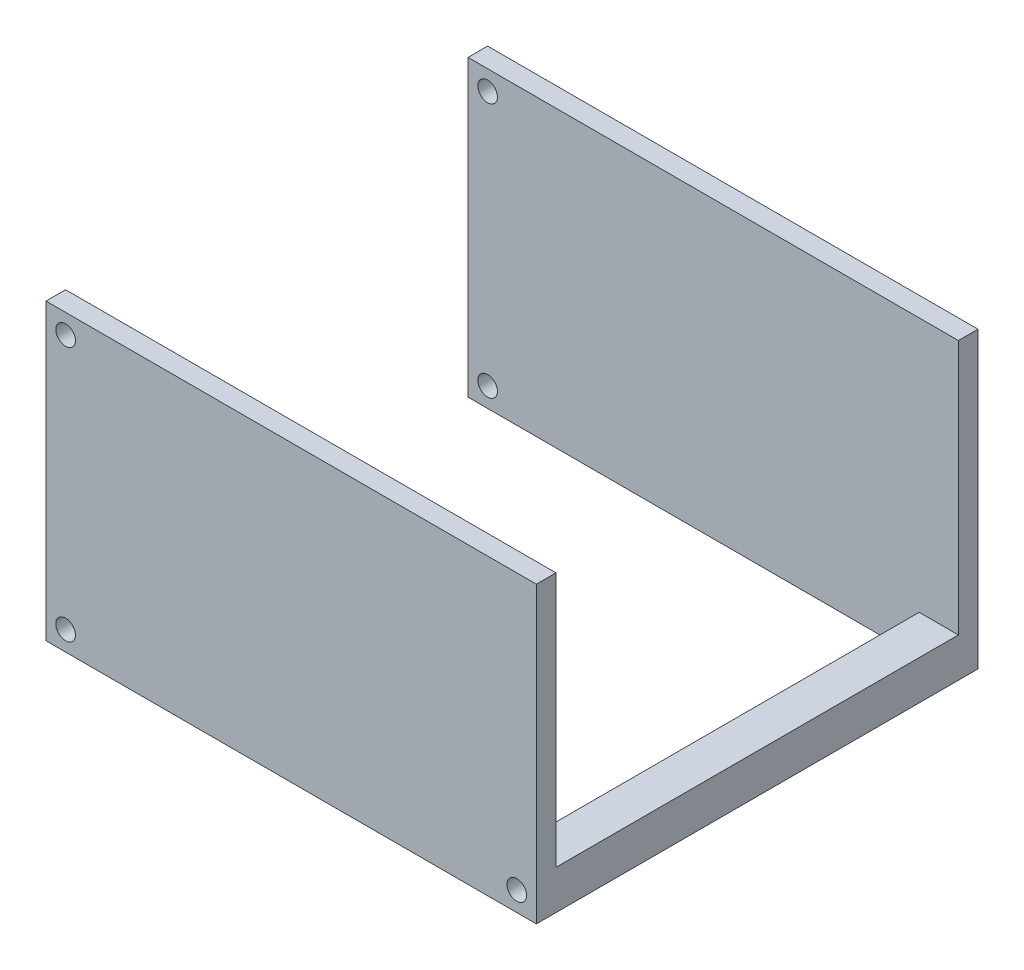
ISO-10303-21;
HEADER;
FILE_DESCRIPTION(('STEP AP214'),'2;1');
FILE_NAME('part.step','',(''),(''),'','','');
FILE_SCHEMA(('AUTOMOTIVE_DESIGN { 1 0 10303 214 1 1 1 1 }'));
ENDSEC;
DATA;
#1=APPLICATION_CONTEXT('core data for automotive mechanical design processes');
#2=APPLICATION_PROTOCOL_DEFINITION('international standard','automotive_design',2000,#1);
#3=PRODUCT_CONTEXT('',#1,'mechanical');
#4=PRODUCT('Part','Part','',(#3));
#5=PRODUCT_RELATED_PRODUCT_CATEGORY('part','',(#4));
#6=PRODUCT_DEFINITION_FORMATION('','',#4);
#7=PRODUCT_DEFINITION_CONTEXT('part definition',#1,'design');
#8=PRODUCT_DEFINITION('design','',#6,#7);
#9=PRODUCT_DEFINITION_SHAPE('','',#8);
#10=(LENGTH_UNIT() NAMED_UNIT(*) SI_UNIT(.MILLI.,.METRE.));
#11=(NAMED_UNIT(*) PLANE_ANGLE_UNIT() SI_UNIT($,.RADIAN.));
#12=(NAMED_UNIT(*) SI_UNIT($,.STERADIAN.) SOLID_ANGLE_UNIT());
#13=UNCERTAINTY_MEASURE_WITH_UNIT(LENGTH_MEASURE(1.E-05),#10,'distance_accuracy_value','');
#14=(GEOMETRIC_REPRESENTATION_CONTEXT(3) GLOBAL_UNCERTAINTY_ASSIGNED_CONTEXT((#13)) GLOBAL_UNIT_ASSIGNED_CONTEXT((#10,
#11,#12)) REPRESENTATION_CONTEXT('',''));
#15=CARTESIAN_POINT('',(0.,0.,0.));
#16=DIRECTION('',(0.,0.,1.));
#17=DIRECTION('',(1.,0.,0.));
#18=AXIS2_PLACEMENT_3D('',#15,#16,#17);
#19=CARTESIAN_POINT('',(-25.,15.,45.03));
#20=DIRECTION('',(0.,-1.,0.));
#21=DIRECTION('',(0.,0.,-1.));
#22=AXIS2_PLACEMENT_3D('',#19,#20,#21);
#23=PLANE('',#22);
#24=DIRECTION('',(-1.,0.,0.));
#25=VECTOR('',#24,1.);
#26=CARTESIAN_POINT('',(-25.,15.,2.));
#27=LINE('',#26,#25);
#28=CARTESIAN_POINT('',(25.,15.,2.));
#29=VERTEX_POINT('',#28);
#30=CARTESIAN_POINT('',(-25.,15.,2.));
#31=VERTEX_POINT('',#30);
#32=EDGE_CURVE('E147',#29,#31,#27,.T.);
#33=ORIENTED_EDGE('',*,*,#32,.F.);
#34=DIRECTION('',(0.,0.,-1.));
#35=VECTOR('',#34,1.);
#36=CARTESIAN_POINT('',(25.,15.,45.03));
#37=LINE('',#36,#35);
#38=CARTESIAN_POINT('',(25.,15.,0.));
#39=VERTEX_POINT('',#38);
#40=EDGE_CURVE('E210',#29,#39,#37,.T.);
#41=ORIENTED_EDGE('',*,*,#40,.T.);
#42=DIRECTION('',(-1.,0.,0.));
#43=VECTOR('',#42,1.);
#44=CARTESIAN_POINT('',(-25.,15.,0.));
#45=LINE('',#44,#43);
#46=CARTESIAN_POINT('',(-25.,15.,0.));
#47=VERTEX_POINT('',#46);
#48=EDGE_CURVE('E191',#39,#47,#45,.T.);
#49=ORIENTED_EDGE('',*,*,#48,.T.);
#50=DIRECTION('',(0.,0.,-1.));
#51=VECTOR('',#50,1.);
#52=CARTESIAN_POINT('',(-25.,15.,45.03));
#53=LINE('',#52,#51);
#54=EDGE_CURVE('E197',#31,#47,#53,.T.);
#55=ORIENTED_EDGE('',*,*,#54,.F.);
#56=EDGE_LOOP('',(#33,#41,#49,#55));
#57=FACE_BOUND('',#56,.T.);
#58=ADVANCED_FACE('F36',(#57),#23,.F.);
#59=CARTESIAN_POINT('',(21.,-30.03,2.));
#60=DIRECTION('',(1.,0.,0.));
#61=DIRECTION('',(0.,0.,-1.));
#62=AXIS2_PLACEMENT_3D('',#59,#60,#61);
#63=PLANE('',#62);
#64=DIRECTION('',(0.,0.,1.));
#65=VECTOR('',#64,1.);
#66=CARTESIAN_POINT('',(21.,-11.,2.));
#67=LINE('',#66,#65);
#68=CARTESIAN_POINT('',(21.,-11.,2.));
#69=VERTEX_POINT('',#68);
#70=CARTESIAN_POINT('',(21.,-11.,43.03));
#71=VERTEX_POINT('',#70);
#72=EDGE_CURVE('E53',#69,#71,#67,.T.);
#73=ORIENTED_EDGE('',*,*,#72,.F.);
#74=DIRECTION('',(0.,1.,0.));
#75=VECTOR('',#74,1.);
#76=CARTESIAN_POINT('',(21.,-30.03,2.));
#77=LINE('',#76,#75);
#78=CARTESIAN_POINT('',(21.,-15.,2.));
#79=VERTEX_POINT('',#78);
#80=EDGE_CURVE('E153',#79,#69,#77,.T.);
#81=ORIENTED_EDGE('',*,*,#80,.F.);
#82=DIRECTION('',(0.,0.,-1.));
#83=VECTOR('',#82,1.);
#84=CARTESIAN_POINT('',(21.,-15.,45.03));
#85=LINE('',#84,#83);
#86=CARTESIAN_POINT('',(21.,-15.,43.03));
#87=VERTEX_POINT('',#86);
#88=EDGE_CURVE('E171',#87,#79,#85,.T.);
#89=ORIENTED_EDGE('',*,*,#88,.F.);
#90=DIRECTION('',(0.,1.,0.));
#91=VECTOR('',#90,1.);
#92=CARTESIAN_POINT('',(21.,-30.03,43.03));
#93=LINE('',#92,#91);
#94=EDGE_CURVE('E156',#87,#71,#93,.T.);
#95=ORIENTED_EDGE('',*,*,#94,.T.);
#96=EDGE_LOOP('',(#73,#81,#89,#95));
#97=FACE_BOUND('',#96,.T.);
#98=ADVANCED_FACE('F245',(#97),#63,.F.);
#99=CARTESIAN_POINT('',(-25.,15.,45.03));
#100=DIRECTION('',(1.,0.,0.));
#101=DIRECTION('',(0.,1.,0.));
#102=AXIS2_PLACEMENT_3D('',#99,#100,#101);
#103=PLANE('',#102);
#104=DIRECTION('',(0.,0.,-1.));
#105=VECTOR('',#104,1.);
#106=CARTESIAN_POINT('',(-25.,-15.,45.03));
#107=LINE('',#106,#105);
#108=CARTESIAN_POINT('',(-25.,-15.,2.));
#109=VERTEX_POINT('',#108);
#110=CARTESIAN_POINT('',(-25.,-15.,0.));
#111=VERTEX_POINT('',#110);
#112=EDGE_CURVE('E45',#109,#111,#107,.T.);
#113=ORIENTED_EDGE('',*,*,#112,.F.);
#114=DIRECTION('',(0.,1.,0.));
#115=VECTOR('',#114,1.);
#116=CARTESIAN_POINT('',(-25.,-30.03,2.));
#117=LINE('',#116,#115);
#118=EDGE_CURVE('E149',#109,#31,#117,.T.);
#119=ORIENTED_EDGE('',*,*,#118,.T.);
#120=ORIENTED_EDGE('',*,*,#54,.T.);
#121=DIRECTION('',(0.,-1.,0.));
#122=VECTOR('',#121,1.);
#123=CARTESIAN_POINT('',(-25.,15.,0.));
#124=LINE('',#123,#122);
#125=EDGE_CURVE('E184',#47,#111,#124,.T.);
#126=ORIENTED_EDGE('',*,*,#125,.T.);
#127=EDGE_LOOP('',(#113,#119,#120,#126));
#128=FACE_BOUND('',#127,.T.);
#129=ADVANCED_FACE('F252',(#128),#103,.F.);
#130=CARTESIAN_POINT('',(-23.,-13.,45.03));
#131=DIRECTION('',(0.,0.,-1.));
#132=DIRECTION('',(-1.,0.,0.));
#133=AXIS2_PLACEMENT_3D('',#130,#131,#132);
#134=CYLINDRICAL_SURFACE('',#133,1.);
#135=CARTESIAN_POINT('',(-23.,-13.,2.));
#136=DIRECTION('',(0.,0.,-1.));
#137=DIRECTION('',(-1.,0.,0.));
#138=AXIS2_PLACEMENT_3D('',#135,#136,#137);
#139=CIRCLE('',#138,1.);
#140=CARTESIAN_POINT('',(-24.,-13.,2.));
#141=VERTEX_POINT('',#140);
#142=EDGE_CURVE('E165',#141,#141,#139,.T.);
#143=ORIENTED_EDGE('',*,*,#142,.F.);
#144=EDGE_LOOP('',(#143));
#145=FACE_BOUND('',#144,.T.);
#146=CARTESIAN_POINT('',(-23.,-13.,0.));
#147=DIRECTION('',(0.,0.,1.));
#148=DIRECTION('',(1.,0.,0.));
#149=AXIS2_PLACEMENT_3D('',#146,#147,#148);
#150=CIRCLE('',#149,1.);
#151=CARTESIAN_POINT('',(-22.,-13.,0.));
#152=VERTEX_POINT('',#151);
#153=EDGE_CURVE('E178',#152,#152,#150,.T.);
#154=ORIENTED_EDGE('',*,*,#153,.F.);
#155=EDGE_LOOP('',(#154));
#156=FACE_BOUND('',#155,.T.);
#157=ADVANCED_FACE('F239',(#145,#156),#134,.F.);
#158=CARTESIAN_POINT('',(-23.,13.,45.03));
#159=DIRECTION('',(0.,0.,-1.));
#160=DIRECTION('',(-1.,0.,0.));
#161=AXIS2_PLACEMENT_3D('',#158,#159,#160);
#162=CYLINDRICAL_SURFACE('',#161,1.);
#163=CARTESIAN_POINT('',(-23.,13.,2.));
#164=DIRECTION('',(0.,0.,-1.));
#165=DIRECTION('',(-1.,0.,0.));
#166=AXIS2_PLACEMENT_3D('',#163,#164,#165);
#167=CIRCLE('',#166,1.);
#168=CARTESIAN_POINT('',(-24.,13.,2.));
#169=VERTEX_POINT('',#168);
#170=EDGE_CURVE('E40',#169,#169,#167,.T.);
#171=ORIENTED_EDGE('',*,*,#170,.F.);
#172=EDGE_LOOP('',(#171));
#173=FACE_BOUND('',#172,.T.);
#174=CARTESIAN_POINT('',(-23.,13.,0.));
#175=DIRECTION('',(0.,0.,1.));
#176=DIRECTION('',(1.,0.,0.));
#177=AXIS2_PLACEMENT_3D('',#174,#175,#176);
#178=CIRCLE('',#177,1.);
#179=CARTESIAN_POINT('',(-22.,13.,0.));
#180=VERTEX_POINT('',#179);
#181=EDGE_CURVE('E174',#180,#180,#178,.T.);
#182=ORIENTED_EDGE('',*,*,#181,.F.);
#183=EDGE_LOOP('',(#182));
#184=FACE_BOUND('',#183,.T.);
#185=ADVANCED_FACE('F225',(#173,#184),#162,.F.);
#186=CARTESIAN_POINT('',(0.,0.,45.03));
#187=DIRECTION('',(0.,0.,1.));
#188=DIRECTION('',(1.,0.,0.));
#189=AXIS2_PLACEMENT_3D('',#186,#187,#188);
#190=PLANE('',#189);
#191=CARTESIAN_POINT('',(23.,-13.,45.03));
#192=DIRECTION('',(0.,0.,1.));
#193=DIRECTION('',(1.,0.,0.));
#194=AXIS2_PLACEMENT_3D('',#191,#192,#193);
#195=CIRCLE('',#194,1.);
#196=CARTESIAN_POINT('',(24.,-13.,45.03));
#197=VERTEX_POINT('',#196);
#198=EDGE_CURVE('E139',#197,#197,#195,.T.);
#199=ORIENTED_EDGE('',*,*,#198,.F.);
#200=EDGE_LOOP('',(#199));
#201=FACE_BOUND('',#200,.T.);
#202=CARTESIAN_POINT('',(-23.,-13.,45.03));
#203=DIRECTION('',(0.,0.,1.));
#204=DIRECTION('',(1.,0.,0.));
#205=AXIS2_PLACEMENT_3D('',#202,#203,#204);
#206=CIRCLE('',#205,1.);
#207=CARTESIAN_POINT('',(-22.,-13.,45.03));
#208=VERTEX_POINT('',#207);
#209=EDGE_CURVE('E181',#208,#208,#206,.T.);
#210=ORIENTED_EDGE('',*,*,#209,.F.);
#211=EDGE_LOOP('',(#210));
#212=FACE_BOUND('',#211,.T.);
#213=DIRECTION('',(0.,-1.,0.));
#214=VECTOR('',#213,1.);
#215=CARTESIAN_POINT('',(-25.,15.,45.03));
#216=LINE('',#215,#214);
#217=CARTESIAN_POINT('',(-25.,15.,45.03));
#218=VERTEX_POINT('',#217);
#219=CARTESIAN_POINT('',(-25.,-15.,45.03));
#220=VERTEX_POINT('',#219);
#221=EDGE_CURVE('E187',#218,#220,#216,.T.);
#222=ORIENTED_EDGE('',*,*,#221,.T.);
#223=DIRECTION('',(1.,0.,0.));
#224=VECTOR('',#223,1.);
#225=CARTESIAN_POINT('',(-25.,-15.,45.03));
#226=LINE('',#225,#224);
#227=CARTESIAN_POINT('',(25.,-15.,45.03));
#228=VERTEX_POINT('',#227);
#229=EDGE_CURVE('E190',#220,#228,#226,.T.);
#230=ORIENTED_EDGE('',*,*,#229,.T.);
#231=DIRECTION('',(0.,1.,0.));
#232=VECTOR('',#231,1.);
#233=CARTESIAN_POINT('',(25.,15.,45.03));
#234=LINE('',#233,#232);
#235=CARTESIAN_POINT('',(25.,15.,45.03));
#236=VERTEX_POINT('',#235);
#237=EDGE_CURVE('E193',#228,#236,#234,.T.);
#238=ORIENTED_EDGE('',*,*,#237,.T.);
#239=DIRECTION('',(-1.,0.,0.));
#240=VECTOR('',#239,1.);
#241=CARTESIAN_POINT('',(-25.,15.,45.03));
#242=LINE('',#241,#240);
#243=EDGE_CURVE('E195',#236,#218,#242,.T.);
#244=ORIENTED_EDGE('',*,*,#243,.T.);
#245=EDGE_LOOP('',(#222,#230,#238,#244));
#246=FACE_BOUND('',#245,.T.);
#247=CARTESIAN_POINT('',(-23.,13.,45.03));
#248=DIRECTION('',(0.,0.,1.));
#249=DIRECTION('',(1.,0.,0.));
#250=AXIS2_PLACEMENT_3D('',#247,#248,#249);
#251=CIRCLE('',#250,1.);
#252=CARTESIAN_POINT('',(-22.,13.,45.03));
#253=VERTEX_POINT('',#252);
#254=EDGE_CURVE('E175',#253,#253,#251,.T.);
#255=ORIENTED_EDGE('',*,*,#254,.F.);
#256=EDGE_LOOP('',(#255));
#257=FACE_BOUND('',#256,.T.);
#258=ADVANCED_FACE('F228',(#201,#212,#246,#257),#190,.T.);
#259=CARTESIAN_POINT('',(0.,0.,0.));
#260=DIRECTION('',(0.,0.,1.));
#261=DIRECTION('',(1.,0.,0.));
#262=AXIS2_PLACEMENT_3D('',#259,#260,#261);
#263=PLANE('',#262);
#264=CARTESIAN_POINT('',(23.,-13.,0.));
#265=DIRECTION('',(0.,0.,1.));
#266=DIRECTION('',(1.,0.,0.));
#267=AXIS2_PLACEMENT_3D('',#264,#265,#266);
#268=CIRCLE('',#267,1.);
#269=CARTESIAN_POINT('',(24.,-13.,0.));
#270=VERTEX_POINT('',#269);
#271=EDGE_CURVE('E141',#270,#270,#268,.T.);
#272=ORIENTED_EDGE('',*,*,#271,.T.);
#273=EDGE_LOOP('',(#272));
#274=FACE_BOUND('',#273,.T.);
#275=ORIENTED_EDGE('',*,*,#125,.F.);
#276=ORIENTED_EDGE('',*,*,#48,.F.);
#277=DIRECTION('',(0.,1.,0.));
#278=VECTOR('',#277,1.);
#279=CARTESIAN_POINT('',(25.,15.,0.));
#280=LINE('',#279,#278);
#281=CARTESIAN_POINT('',(25.,-15.,0.));
#282=VERTEX_POINT('',#281);
#283=EDGE_CURVE('E202',#282,#39,#280,.T.);
#284=ORIENTED_EDGE('',*,*,#283,.F.);
#285=DIRECTION('',(1.,0.,0.));
#286=VECTOR('',#285,1.);
#287=CARTESIAN_POINT('',(-25.,-15.,0.));
#288=LINE('',#287,#286);
#289=EDGE_CURVE('E200',#111,#282,#288,.T.);
#290=ORIENTED_EDGE('',*,*,#289,.F.);
#291=EDGE_LOOP('',(#275,#276,#284,#290));
#292=FACE_BOUND('',#291,.T.);
#293=ORIENTED_EDGE('',*,*,#153,.T.);
#294=EDGE_LOOP('',(#293));
#295=FACE_BOUND('',#294,.T.);
#296=ORIENTED_EDGE('',*,*,#181,.T.);
#297=EDGE_LOOP('',(#296));
#298=FACE_BOUND('',#297,.T.);
#299=ADVANCED_FACE('F230',(#274,#292,#295,#298),#263,.F.);
#300=CARTESIAN_POINT('',(-25.,15.,43.03));
#301=VERTEX_POINT('',#300);
#302=EDGE_CURVE('E207',#218,#301,#53,.T.);
#303=ORIENTED_EDGE('',*,*,#302,.T.);
#304=DIRECTION('',(0.,1.,0.));
#305=VECTOR('',#304,1.);
#306=CARTESIAN_POINT('',(-25.,-30.03,43.03));
#307=LINE('',#306,#305);
#308=CARTESIAN_POINT('',(-25.,-15.,43.03));
#309=VERTEX_POINT('',#308);
#310=EDGE_CURVE('E61',#309,#301,#307,.T.);
#311=ORIENTED_EDGE('',*,*,#310,.F.);
#312=EDGE_CURVE('E11',#220,#309,#107,.T.);
#313=ORIENTED_EDGE('',*,*,#312,.F.);
#314=ORIENTED_EDGE('',*,*,#221,.F.);
#315=EDGE_LOOP('',(#303,#311,#313,#314));
#316=FACE_BOUND('',#315,.T.);
#317=ADVANCED_FACE('F38',(#316),#103,.F.);
#318=CARTESIAN_POINT('',(-25.,-15.,45.03));
#319=DIRECTION('',(0.,1.,0.));
#320=DIRECTION('',(0.,0.,1.));
#321=AXIS2_PLACEMENT_3D('',#318,#319,#320);
#322=PLANE('',#321);
#323=ORIENTED_EDGE('',*,*,#88,.T.);
#324=DIRECTION('',(-1.,0.,0.));
#325=VECTOR('',#324,1.);
#326=CARTESIAN_POINT('',(-25.,-15.,2.));
#327=LINE('',#326,#325);
#328=EDGE_CURVE('E168',#79,#109,#327,.T.);
#329=ORIENTED_EDGE('',*,*,#328,.T.);
#330=ORIENTED_EDGE('',*,*,#112,.T.);
#331=ORIENTED_EDGE('',*,*,#289,.T.);
#332=DIRECTION('',(0.,0.,-1.));
#333=VECTOR('',#332,1.);
#334=CARTESIAN_POINT('',(25.,-15.,45.03));
#335=LINE('',#334,#333);
#336=EDGE_CURVE('E213',#228,#282,#335,.T.);
#337=ORIENTED_EDGE('',*,*,#336,.F.);
#338=ORIENTED_EDGE('',*,*,#229,.F.);
#339=ORIENTED_EDGE('',*,*,#312,.T.);
#340=DIRECTION('',(1.,0.,0.));
#341=VECTOR('',#340,1.);
#342=CARTESIAN_POINT('',(-25.,-15.,43.03));
#343=LINE('',#342,#341);
#344=EDGE_CURVE('E162',#309,#87,#343,.T.);
#345=ORIENTED_EDGE('',*,*,#344,.T.);
#346=EDGE_LOOP('',(#323,#329,#330,#331,#337,#338,#339,#345));
#347=FACE_BOUND('',#346,.T.);
#348=ADVANCED_FACE('F263',(#347),#322,.F.);
#349=CARTESIAN_POINT('',(25.,15.,45.03));
#350=DIRECTION('',(-1.,0.,0.));
#351=DIRECTION('',(0.,-1.,0.));
#352=AXIS2_PLACEMENT_3D('',#349,#350,#351);
#353=PLANE('',#352);
#354=ORIENTED_EDGE('',*,*,#40,.F.);
#355=DIRECTION('',(0.,1.,0.));
#356=VECTOR('',#355,1.);
#357=CARTESIAN_POINT('',(25.,-11.,2.));
#358=LINE('',#357,#356);
#359=CARTESIAN_POINT('',(25.,-11.,2.));
#360=VERTEX_POINT('',#359);
#361=EDGE_CURVE('E124',#360,#29,#358,.T.);
#362=ORIENTED_EDGE('',*,*,#361,.F.);
#363=DIRECTION('',(0.,0.,-1.));
#364=VECTOR('',#363,1.);
#365=CARTESIAN_POINT('',(25.,-11.,2.));
#366=LINE('',#365,#364);
#367=CARTESIAN_POINT('',(25.,-11.,43.03));
#368=VERTEX_POINT('',#367);
#369=EDGE_CURVE('E128',#368,#360,#366,.T.);
#370=ORIENTED_EDGE('',*,*,#369,.F.);
#371=DIRECTION('',(0.,1.,0.));
#372=VECTOR('',#371,1.);
#373=CARTESIAN_POINT('',(25.,-11.,43.03));
#374=LINE('',#373,#372);
#375=CARTESIAN_POINT('',(25.,15.,43.03));
#376=VERTEX_POINT('',#375);
#377=EDGE_CURVE('E114',#368,#376,#374,.T.);
#378=ORIENTED_EDGE('',*,*,#377,.T.);
#379=EDGE_CURVE('E211',#236,#376,#37,.T.);
#380=ORIENTED_EDGE('',*,*,#379,.F.);
#381=ORIENTED_EDGE('',*,*,#237,.F.);
#382=ORIENTED_EDGE('',*,*,#336,.T.);
#383=ORIENTED_EDGE('',*,*,#283,.T.);
#384=EDGE_LOOP('',(#354,#362,#370,#378,#380,#381,#382,#383));
#385=FACE_BOUND('',#384,.T.);
#386=ADVANCED_FACE('F133',(#385),#353,.F.);
#387=ORIENTED_EDGE('',*,*,#379,.T.);
#388=DIRECTION('',(1.,0.,0.));
#389=VECTOR('',#388,1.);
#390=CARTESIAN_POINT('',(-25.,15.,43.03));
#391=LINE('',#390,#389);
#392=EDGE_CURVE('E119',#301,#376,#391,.T.);
#393=ORIENTED_EDGE('',*,*,#392,.F.);
#394=ORIENTED_EDGE('',*,*,#302,.F.);
#395=ORIENTED_EDGE('',*,*,#243,.F.);
#396=EDGE_LOOP('',(#387,#393,#394,#395));
#397=FACE_BOUND('',#396,.T.);
#398=ADVANCED_FACE('F248',(#397),#23,.F.);
#399=CARTESIAN_POINT('',(-23.,-13.,43.03));
#400=DIRECTION('',(0.,0.,1.));
#401=DIRECTION('',(1.,0.,0.));
#402=AXIS2_PLACEMENT_3D('',#399,#400,#401);
#403=CIRCLE('',#402,1.);
#404=CARTESIAN_POINT('',(-22.,-13.,43.03));
#405=VERTEX_POINT('',#404);
#406=EDGE_CURVE('E159',#405,#405,#403,.T.);
#407=ORIENTED_EDGE('',*,*,#406,.F.);
#408=EDGE_LOOP('',(#407));
#409=FACE_BOUND('',#408,.T.);
#410=ORIENTED_EDGE('',*,*,#209,.T.);
#411=EDGE_LOOP('',(#410));
#412=FACE_BOUND('',#411,.T.);
#413=ADVANCED_FACE('F223',(#409,#412),#134,.F.);
#414=CARTESIAN_POINT('',(-23.,13.,43.03));
#415=DIRECTION('',(0.,0.,1.));
#416=DIRECTION('',(1.,0.,0.));
#417=AXIS2_PLACEMENT_3D('',#414,#415,#416);
#418=CIRCLE('',#417,1.);
#419=CARTESIAN_POINT('',(-22.,13.,43.03));
#420=VERTEX_POINT('',#419);
#421=EDGE_CURVE('E152',#420,#420,#418,.T.);
#422=ORIENTED_EDGE('',*,*,#421,.F.);
#423=EDGE_LOOP('',(#422));
#424=FACE_BOUND('',#423,.T.);
#425=ORIENTED_EDGE('',*,*,#254,.T.);
#426=EDGE_LOOP('',(#425));
#427=FACE_BOUND('',#426,.T.);
#428=ADVANCED_FACE('F219',(#424,#427),#162,.F.);
#429=CARTESIAN_POINT('',(-25.,-30.03,2.));
#430=DIRECTION('',(0.,0.,-1.));
#431=DIRECTION('',(-1.,0.,0.));
#432=AXIS2_PLACEMENT_3D('',#429,#430,#431);
#433=PLANE('',#432);
#434=ORIENTED_EDGE('',*,*,#142,.T.);
#435=EDGE_LOOP('',(#434));
#436=FACE_BOUND('',#435,.T.);
#437=ORIENTED_EDGE('',*,*,#170,.T.);
#438=EDGE_LOOP('',(#437));
#439=FACE_BOUND('',#438,.T.);
#440=ORIENTED_EDGE('',*,*,#80,.T.);
#441=DIRECTION('',(-1.,0.,0.));
#442=VECTOR('',#441,1.);
#443=CARTESIAN_POINT('',(21.,-11.,2.));
#444=LINE('',#443,#442);
#445=EDGE_CURVE('E125',#360,#69,#444,.T.);
#446=ORIENTED_EDGE('',*,*,#445,.F.);
#447=ORIENTED_EDGE('',*,*,#361,.T.);
#448=ORIENTED_EDGE('',*,*,#32,.T.);
#449=ORIENTED_EDGE('',*,*,#118,.F.);
#450=ORIENTED_EDGE('',*,*,#328,.F.);
#451=EDGE_LOOP('',(#440,#446,#447,#448,#449,#450));
#452=FACE_BOUND('',#451,.T.);
#453=ADVANCED_FACE('F222',(#436,#439,#452),#433,.F.);
#454=CARTESIAN_POINT('',(-25.,-30.03,43.03));
#455=DIRECTION('',(0.,0.,1.));
#456=DIRECTION('',(1.,0.,0.));
#457=AXIS2_PLACEMENT_3D('',#454,#455,#456);
#458=PLANE('',#457);
#459=ORIENTED_EDGE('',*,*,#406,.T.);
#460=EDGE_LOOP('',(#459));
#461=FACE_BOUND('',#460,.T.);
#462=ORIENTED_EDGE('',*,*,#421,.T.);
#463=EDGE_LOOP('',(#462));
#464=FACE_BOUND('',#463,.T.);
#465=ORIENTED_EDGE('',*,*,#310,.T.);
#466=ORIENTED_EDGE('',*,*,#392,.T.);
#467=ORIENTED_EDGE('',*,*,#377,.F.);
#468=DIRECTION('',(1.,0.,0.));
#469=VECTOR('',#468,1.);
#470=CARTESIAN_POINT('',(21.,-11.,43.03));
#471=LINE('',#470,#469);
#472=EDGE_CURVE('E117',#71,#368,#471,.T.);
#473=ORIENTED_EDGE('',*,*,#472,.F.);
#474=ORIENTED_EDGE('',*,*,#94,.F.);
#475=ORIENTED_EDGE('',*,*,#344,.F.);
#476=EDGE_LOOP('',(#465,#466,#467,#473,#474,#475));
#477=FACE_BOUND('',#476,.T.);
#478=ADVANCED_FACE('F115',(#461,#464,#477),#458,.F.);
#479=CARTESIAN_POINT('',(23.,-13.,0.));
#480=DIRECTION('',(0.,0.,1.));
#481=DIRECTION('',(1.,0.,0.));
#482=AXIS2_PLACEMENT_3D('',#479,#480,#481);
#483=CYLINDRICAL_SURFACE('',#482,1.);
#484=ORIENTED_EDGE('',*,*,#271,.F.);
#485=EDGE_LOOP('',(#484));
#486=FACE_BOUND('',#485,.T.);
#487=ORIENTED_EDGE('',*,*,#198,.T.);
#488=EDGE_LOOP('',(#487));
#489=FACE_BOUND('',#488,.T.);
#490=ADVANCED_FACE('F299',(#486,#489),#483,.F.);
#491=CARTESIAN_POINT('',(0.,-11.,0.));
#492=DIRECTION('',(0.,1.,0.));
#493=DIRECTION('',(0.,0.,1.));
#494=AXIS2_PLACEMENT_3D('',#491,#492,#493);
#495=PLANE('',#494);
#496=ORIENTED_EDGE('',*,*,#72,.T.);
#497=ORIENTED_EDGE('',*,*,#472,.T.);
#498=ORIENTED_EDGE('',*,*,#369,.T.);
#499=ORIENTED_EDGE('',*,*,#445,.T.);
#500=EDGE_LOOP('',(#496,#497,#498,#499));
#501=FACE_BOUND('',#500,.T.);
#502=ADVANCED_FACE('F127',(#501),#495,.T.);
#503=CLOSED_SHELL('',(#58,#98,#129,#157,#185,#258,#299,#317,#348,#386,#398,#413,#428,#453,#478,
#490,#502));
#504=MANIFOLD_SOLID_BREP('B2',#503);
#505=ADVANCED_BREP_SHAPE_REPRESENTATION('',(#18,#504),#14);
#506=SHAPE_DEFINITION_REPRESENTATION(#9,#505);
ENDSEC;
END-ISO-10303-21;
